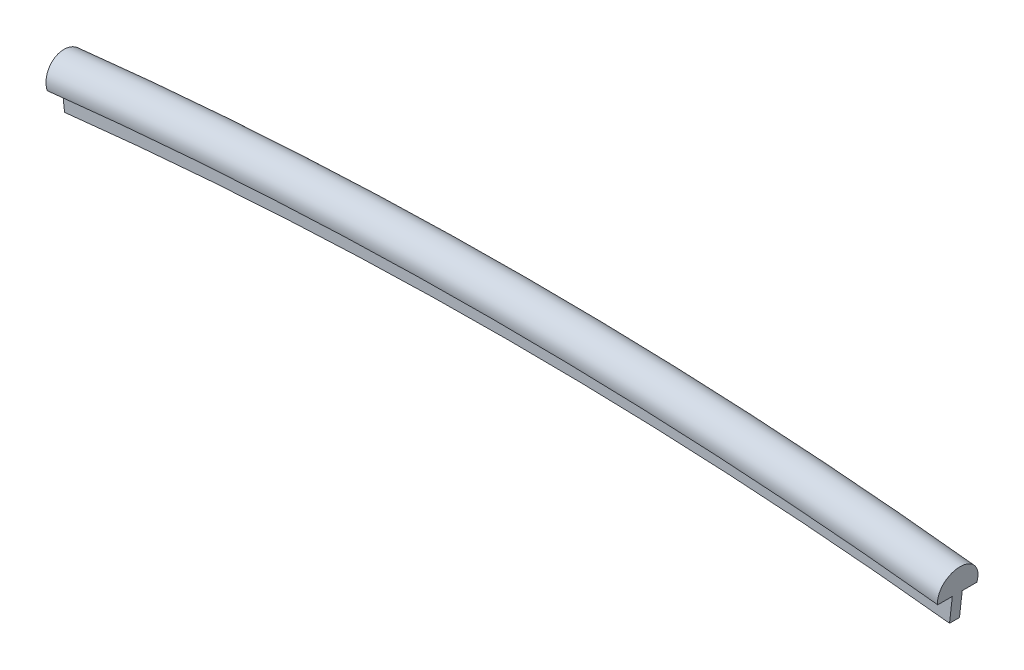
ISO-10303-21;
HEADER;
FILE_DESCRIPTION(('STEP AP214'),'2;1');
FILE_NAME('part.step','',(''),(''),'','','');
FILE_SCHEMA(('AUTOMOTIVE_DESIGN { 1 0 10303 214 1 1 1 1 }'));
ENDSEC;
DATA;
#1=APPLICATION_CONTEXT('core data for automotive mechanical design processes');
#2=APPLICATION_PROTOCOL_DEFINITION('international standard','automotive_design',2000,#1);
#3=PRODUCT_CONTEXT('',#1,'mechanical');
#4=PRODUCT('Part','Part','',(#3));
#5=PRODUCT_RELATED_PRODUCT_CATEGORY('part','',(#4));
#6=PRODUCT_DEFINITION_FORMATION('','',#4);
#7=PRODUCT_DEFINITION_CONTEXT('part definition',#1,'design');
#8=PRODUCT_DEFINITION('design','',#6,#7);
#9=PRODUCT_DEFINITION_SHAPE('','',#8);
#10=(LENGTH_UNIT() NAMED_UNIT(*) SI_UNIT(.MILLI.,.METRE.));
#11=(NAMED_UNIT(*) PLANE_ANGLE_UNIT() SI_UNIT($,.RADIAN.));
#12=(NAMED_UNIT(*) SI_UNIT($,.STERADIAN.) SOLID_ANGLE_UNIT());
#13=UNCERTAINTY_MEASURE_WITH_UNIT(LENGTH_MEASURE(1.E-05),#10,'distance_accuracy_value','');
#14=(GEOMETRIC_REPRESENTATION_CONTEXT(3) GLOBAL_UNCERTAINTY_ASSIGNED_CONTEXT((#13)) GLOBAL_UNIT_ASSIGNED_CONTEXT((#10,
#11,#12)) REPRESENTATION_CONTEXT('',''));
#15=CARTESIAN_POINT('',(0.,0.,0.));
#16=DIRECTION('',(0.,0.,1.));
#17=DIRECTION('',(1.,0.,0.));
#18=AXIS2_PLACEMENT_3D('',#15,#16,#17);
#19=CARTESIAN_POINT('',(0.,0.,70.5976415970385));
#20=DIRECTION('',(0.,0.,1.));
#21=DIRECTION('',(1.,0.,0.));
#22=AXIS2_PLACEMENT_3D('',#19,#20,#21);
#23=CYLINDRICAL_SURFACE('',#22,241.3);
#24=CARTESIAN_POINT('',(0.,0.,1.18));
#25=DIRECTION('',(0.,0.,1.));
#26=DIRECTION('',(1.,0.,0.));
#27=AXIS2_PLACEMENT_3D('',#24,#25,#26);
#28=CIRCLE('',#27,241.3);
#29=CARTESIAN_POINT('',(26.9139041867899,239.794353064088,1.18));
#30=VERTEX_POINT('',#29);
#31=CARTESIAN_POINT('',(-26.9139041867899,239.794353064088,1.18));
#32=VERTEX_POINT('',#31);
#33=EDGE_CURVE('E11',#30,#32,#28,.T.);
#34=ORIENTED_EDGE('',*,*,#33,.T.);
#35=DIRECTION('',(0.,0.,-1.));
#36=VECTOR('',#35,1.);
#37=CARTESIAN_POINT('',(-26.9139041867899,239.794353064088,1.18));
#38=LINE('',#37,#36);
#39=CARTESIAN_POINT('',(-26.9139041867899,239.794353064088,0.3));
#40=VERTEX_POINT('',#39);
#41=EDGE_CURVE('E103',#32,#40,#38,.T.);
#42=ORIENTED_EDGE('',*,*,#41,.T.);
#43=CARTESIAN_POINT('',(0.,0.,0.299999999999995));
#44=DIRECTION('',(0.,0.,1.));
#45=DIRECTION('',(1.,0.,0.));
#46=AXIS2_PLACEMENT_3D('',#43,#44,#45);
#47=CIRCLE('',#46,241.3);
#48=CARTESIAN_POINT('',(26.9139041867899,239.794353064088,0.3));
#49=VERTEX_POINT('',#48);
#50=EDGE_CURVE('E85',#49,#40,#47,.T.);
#51=ORIENTED_EDGE('',*,*,#50,.F.);
#52=DIRECTION('',(0.,0.,-1.));
#53=VECTOR('',#52,1.);
#54=CARTESIAN_POINT('',(26.9139041867899,239.794353064088,1.18));
#55=LINE('',#54,#53);
#56=EDGE_CURVE('E117',#30,#49,#55,.T.);
#57=ORIENTED_EDGE('',*,*,#56,.F.);
#58=EDGE_LOOP('',(#34,#42,#51,#57));
#59=FACE_BOUND('',#58,.T.);
#60=ADVANCED_FACE('F33',(#59),#23,.F.);
#61=CARTESIAN_POINT('',(0.,0.,0.));
#62=DIRECTION('',(0.,0.,1.));
#63=DIRECTION('',(1.,0.,0.));
#64=AXIS2_PLACEMENT_3D('',#61,#62,#63);
#65=TOROIDAL_SURFACE('',#64,241.586013989906,1.21416802890791);
#66=CARTESIAN_POINT('',(0.,0.,-1.18));
#67=DIRECTION('',(0.,0.,1.));
#68=DIRECTION('',(1.,0.,0.));
#69=AXIS2_PLACEMENT_3D('',#66,#67,#68);
#70=CIRCLE('',#69,241.3);
#71=CARTESIAN_POINT('',(26.9139041867899,239.794353064088,-1.18));
#72=VERTEX_POINT('',#71);
#73=CARTESIAN_POINT('',(-26.9139041867899,239.794353064088,-1.18));
#74=VERTEX_POINT('',#73);
#75=EDGE_CURVE('E41',#72,#74,#70,.T.);
#76=ORIENTED_EDGE('',*,*,#75,.T.);
#77=CARTESIAN_POINT('',(-26.9458053601029,240.078582403818,0.));
#78=DIRECTION('',(0.993760269639816,0.111537108109366,0.));
#79=DIRECTION('',(0.,0.,1.));
#80=AXIS2_PLACEMENT_3D('',#77,#78,#79);
#81=CIRCLE('',#80,1.21416802890791);
#82=EDGE_CURVE('E115',#74,#32,#81,.T.);
#83=ORIENTED_EDGE('',*,*,#82,.T.);
#84=ORIENTED_EDGE('',*,*,#33,.F.);
#85=CARTESIAN_POINT('',(26.9458053601029,240.078582403818,0.));
#86=DIRECTION('',(0.993760269639816,-0.111537108109366,0.));
#87=DIRECTION('',(0.,0.,1.));
#88=AXIS2_PLACEMENT_3D('',#85,#86,#87);
#89=CIRCLE('',#88,1.21416802890791);
#90=EDGE_CURVE('E97',#72,#30,#89,.T.);
#91=ORIENTED_EDGE('',*,*,#90,.F.);
#92=EDGE_LOOP('',(#76,#83,#84,#91));
#93=FACE_BOUND('',#92,.T.);
#94=ADVANCED_FACE('F35',(#93),#65,.T.);
#95=CARTESIAN_POINT('',(0.,0.,70.5976415970385));
#96=DIRECTION('',(0.,0.,1.));
#97=DIRECTION('',(1.,0.,0.));
#98=AXIS2_PLACEMENT_3D('',#95,#96,#97);
#99=CYLINDRICAL_SURFACE('',#98,241.3);
#100=CARTESIAN_POINT('',(0.,0.,-0.299999999999995));
#101=DIRECTION('',(0.,0.,1.));
#102=DIRECTION('',(1.,0.,0.));
#103=AXIS2_PLACEMENT_3D('',#100,#101,#102);
#104=CIRCLE('',#103,241.3);
#105=CARTESIAN_POINT('',(26.9139041867899,239.794353064088,-0.3));
#106=VERTEX_POINT('',#105);
#107=CARTESIAN_POINT('',(-26.9139041867899,239.794353064088,-0.3));
#108=VERTEX_POINT('',#107);
#109=EDGE_CURVE('E132',#106,#108,#104,.T.);
#110=ORIENTED_EDGE('',*,*,#109,.T.);
#111=DIRECTION('',(0.,0.,-1.));
#112=VECTOR('',#111,1.);
#113=CARTESIAN_POINT('',(-26.9139041867899,239.794353064088,-0.3));
#114=LINE('',#113,#112);
#115=EDGE_CURVE('E113',#108,#74,#114,.T.);
#116=ORIENTED_EDGE('',*,*,#115,.T.);
#117=ORIENTED_EDGE('',*,*,#75,.F.);
#118=DIRECTION('',(0.,0.,-1.));
#119=VECTOR('',#118,1.);
#120=CARTESIAN_POINT('',(26.9139041867899,239.794353064088,-0.3));
#121=LINE('',#120,#119);
#122=EDGE_CURVE('E125',#106,#72,#121,.T.);
#123=ORIENTED_EDGE('',*,*,#122,.F.);
#124=EDGE_LOOP('',(#110,#116,#117,#123));
#125=FACE_BOUND('',#124,.T.);
#126=ADVANCED_FACE('F134',(#125),#99,.F.);
#127=CARTESIAN_POINT('',(26.7465985246259,238.303712659628,-0.3));
#128=DIRECTION('',(0.,0.,1.));
#129=DIRECTION('',(1.,0.,0.));
#130=AXIS2_PLACEMENT_3D('',#127,#128,#129);
#131=PLANE('',#130);
#132=CARTESIAN_POINT('',(0.,0.,-0.299999999999995));
#133=DIRECTION('',(0.,0.,1.));
#134=DIRECTION('',(1.,0.,0.));
#135=AXIS2_PLACEMENT_3D('',#132,#133,#134);
#136=CIRCLE('',#135,239.8);
#137=CARTESIAN_POINT('',(26.7465985246259,238.303712659628,-0.3));
#138=VERTEX_POINT('',#137);
#139=CARTESIAN_POINT('',(-26.7465985246259,238.303712659628,-0.3));
#140=VERTEX_POINT('',#139);
#141=EDGE_CURVE('E129',#138,#140,#136,.T.);
#142=ORIENTED_EDGE('',*,*,#141,.T.);
#143=DIRECTION('',(-0.111537108109366,0.993760269639816,0.));
#144=VECTOR('',#143,1.);
#145=CARTESIAN_POINT('',(-26.7465985246259,238.303712659628,-0.3));
#146=LINE('',#145,#144);
#147=EDGE_CURVE('E110',#140,#108,#146,.T.);
#148=ORIENTED_EDGE('',*,*,#147,.T.);
#149=ORIENTED_EDGE('',*,*,#109,.F.);
#150=DIRECTION('',(0.111537108109366,0.993760269639816,0.));
#151=VECTOR('',#150,1.);
#152=CARTESIAN_POINT('',(26.7465985246259,238.303712659628,-0.3));
#153=LINE('',#152,#151);
#154=EDGE_CURVE('E122',#138,#106,#153,.T.);
#155=ORIENTED_EDGE('',*,*,#154,.F.);
#156=EDGE_LOOP('',(#142,#148,#149,#155));
#157=FACE_BOUND('',#156,.T.);
#158=ADVANCED_FACE('F136',(#157),#131,.F.);
#159=CARTESIAN_POINT('',(0.,0.,70.5976415970385));
#160=DIRECTION('',(0.,0.,1.));
#161=DIRECTION('',(1.,0.,0.));
#162=AXIS2_PLACEMENT_3D('',#159,#160,#161);
#163=CYLINDRICAL_SURFACE('',#162,239.8);
#164=CARTESIAN_POINT('',(0.,0.,0.299999999999995));
#165=DIRECTION('',(0.,0.,1.));
#166=DIRECTION('',(1.,0.,0.));
#167=AXIS2_PLACEMENT_3D('',#164,#165,#166);
#168=CIRCLE('',#167,239.8);
#169=CARTESIAN_POINT('',(26.7465985246259,238.303712659628,0.3));
#170=VERTEX_POINT('',#169);
#171=CARTESIAN_POINT('',(-26.7465985246259,238.303712659628,0.3));
#172=VERTEX_POINT('',#171);
#173=EDGE_CURVE('E96',#170,#172,#168,.T.);
#174=ORIENTED_EDGE('',*,*,#173,.T.);
#175=DIRECTION('',(0.,0.,-1.));
#176=VECTOR('',#175,1.);
#177=CARTESIAN_POINT('',(-26.7465985246259,238.303712659628,0.));
#178=LINE('',#177,#176);
#179=EDGE_CURVE('E105',#172,#140,#178,.T.);
#180=ORIENTED_EDGE('',*,*,#179,.T.);
#181=ORIENTED_EDGE('',*,*,#141,.F.);
#182=DIRECTION('',(0.,0.,-1.));
#183=VECTOR('',#182,1.);
#184=CARTESIAN_POINT('',(26.7465985246259,238.303712659628,0.));
#185=LINE('',#184,#183);
#186=EDGE_CURVE('E120',#170,#138,#185,.T.);
#187=ORIENTED_EDGE('',*,*,#186,.F.);
#188=EDGE_LOOP('',(#174,#180,#181,#187));
#189=FACE_BOUND('',#188,.T.);
#190=ADVANCED_FACE('F141',(#189),#163,.F.);
#191=CARTESIAN_POINT('',(26.7465985246259,238.303712659628,0.3));
#192=DIRECTION('',(0.,0.,-1.));
#193=DIRECTION('',(-1.,0.,0.));
#194=AXIS2_PLACEMENT_3D('',#191,#192,#193);
#195=PLANE('',#194);
#196=DIRECTION('',(-0.111537108109366,-0.993760269639816,0.));
#197=VECTOR('',#196,1.);
#198=CARTESIAN_POINT('',(26.7465985246259,238.303712659628,0.3));
#199=LINE('',#198,#197);
#200=EDGE_CURVE('E91',#49,#170,#199,.T.);
#201=ORIENTED_EDGE('',*,*,#200,.F.);
#202=ORIENTED_EDGE('',*,*,#50,.T.);
#203=DIRECTION('',(0.111537108109366,-0.993760269639816,0.));
#204=VECTOR('',#203,1.);
#205=CARTESIAN_POINT('',(-26.7465985246259,238.303712659628,0.3));
#206=LINE('',#205,#204);
#207=EDGE_CURVE('E88',#40,#172,#206,.T.);
#208=ORIENTED_EDGE('',*,*,#207,.T.);
#209=ORIENTED_EDGE('',*,*,#173,.F.);
#210=EDGE_LOOP('',(#201,#202,#208,#209));
#211=FACE_BOUND('',#210,.T.);
#212=ADVANCED_FACE('F87',(#211),#195,.F.);
#213=CARTESIAN_POINT('',(26.9458053601029,240.078582403818,0.));
#214=DIRECTION('',(-0.993760269639816,0.111537108109366,0.));
#215=DIRECTION('',(0.,0.,1.));
#216=AXIS2_PLACEMENT_3D('',#213,#214,#215);
#217=PLANE('',#216);
#218=ORIENTED_EDGE('',*,*,#56,.T.);
#219=ORIENTED_EDGE('',*,*,#200,.T.);
#220=ORIENTED_EDGE('',*,*,#186,.T.);
#221=ORIENTED_EDGE('',*,*,#154,.T.);
#222=ORIENTED_EDGE('',*,*,#122,.T.);
#223=ORIENTED_EDGE('',*,*,#90,.T.);
#224=EDGE_LOOP('',(#218,#219,#220,#221,#222,#223));
#225=FACE_BOUND('',#224,.T.);
#226=ADVANCED_FACE('F143',(#225),#217,.F.);
#227=CARTESIAN_POINT('',(-26.9458053601029,240.078582403818,0.));
#228=DIRECTION('',(-0.993760269639816,-0.111537108109366,0.));
#229=DIRECTION('',(0.,0.,1.));
#230=AXIS2_PLACEMENT_3D('',#227,#228,#229);
#231=PLANE('',#230);
#232=ORIENTED_EDGE('',*,*,#41,.F.);
#233=ORIENTED_EDGE('',*,*,#82,.F.);
#234=ORIENTED_EDGE('',*,*,#115,.F.);
#235=ORIENTED_EDGE('',*,*,#147,.F.);
#236=ORIENTED_EDGE('',*,*,#179,.F.);
#237=ORIENTED_EDGE('',*,*,#207,.F.);
#238=EDGE_LOOP('',(#232,#233,#234,#235,#236,#237));
#239=FACE_BOUND('',#238,.T.);
#240=ADVANCED_FACE('F101',(#239),#231,.T.);
#241=CLOSED_SHELL('',(#60,#94,#126,#158,#190,#212,#226,#240));
#242=MANIFOLD_SOLID_BREP('B2',#241);
#243=ADVANCED_BREP_SHAPE_REPRESENTATION('',(#18,#242),#14);
#244=SHAPE_DEFINITION_REPRESENTATION(#9,#243);
ENDSEC;
END-ISO-10303-21;
